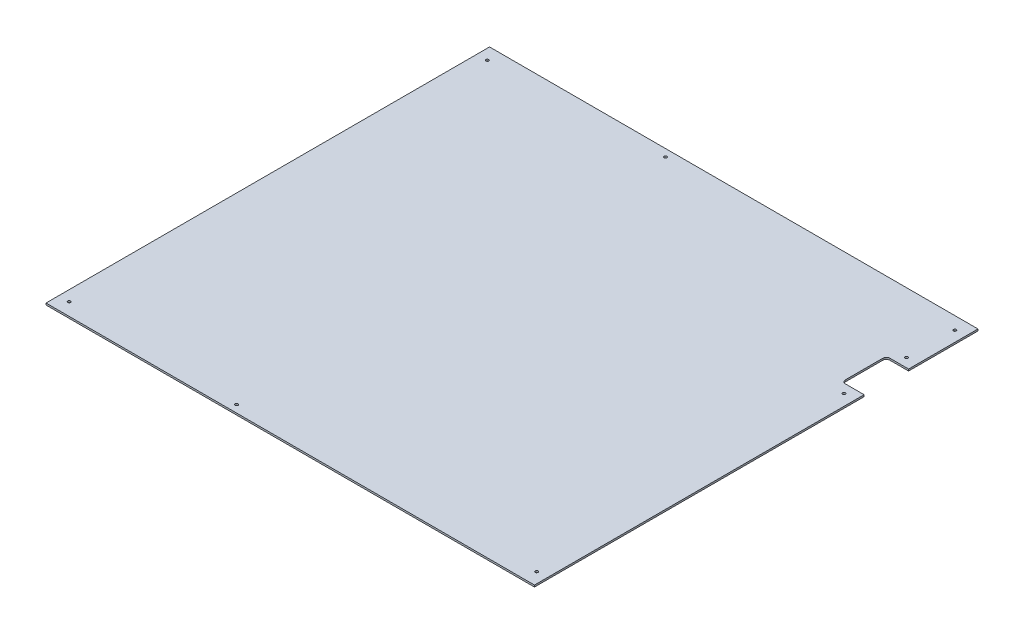
ISO-10303-21;
HEADER;
FILE_DESCRIPTION(('STEP AP214'),'2;1');
FILE_NAME('part.step','',(''),(''),'','','');
FILE_SCHEMA(('AUTOMOTIVE_DESIGN { 1 0 10303 214 1 1 1 1 }'));
ENDSEC;
DATA;
#1=APPLICATION_CONTEXT('core data for automotive mechanical design processes');
#2=APPLICATION_PROTOCOL_DEFINITION('international standard','automotive_design',2000,#1);
#3=PRODUCT_CONTEXT('',#1,'mechanical');
#4=PRODUCT('Part','Part','',(#3));
#5=PRODUCT_RELATED_PRODUCT_CATEGORY('part','',(#4));
#6=PRODUCT_DEFINITION_FORMATION('','',#4);
#7=PRODUCT_DEFINITION_CONTEXT('part definition',#1,'design');
#8=PRODUCT_DEFINITION('design','',#6,#7);
#9=PRODUCT_DEFINITION_SHAPE('','',#8);
#10=(LENGTH_UNIT() NAMED_UNIT(*) SI_UNIT(.MILLI.,.METRE.));
#11=(NAMED_UNIT(*) PLANE_ANGLE_UNIT() SI_UNIT($,.RADIAN.));
#12=(NAMED_UNIT(*) SI_UNIT($,.STERADIAN.) SOLID_ANGLE_UNIT());
#13=UNCERTAINTY_MEASURE_WITH_UNIT(LENGTH_MEASURE(1.E-05),#10,'distance_accuracy_value','');
#14=(GEOMETRIC_REPRESENTATION_CONTEXT(3) GLOBAL_UNCERTAINTY_ASSIGNED_CONTEXT((#13)) GLOBAL_UNIT_ASSIGNED_CONTEXT((#10,
#11,#12)) REPRESENTATION_CONTEXT('',''));
#15=CARTESIAN_POINT('',(0.,0.,0.));
#16=DIRECTION('',(0.,0.,1.));
#17=DIRECTION('',(1.,0.,0.));
#18=AXIS2_PLACEMENT_3D('',#15,#16,#17);
#19=CARTESIAN_POINT('',(549.75,-743.673483458971,-0.750000000000034));
#20=DIRECTION('',(1.,0.,0.));
#21=DIRECTION('',(0.,0.,-1.));
#22=AXIS2_PLACEMENT_3D('',#19,#20,#21);
#23=PLANE('',#22);
#24=DIRECTION('',(0.,1.,0.));
#25=VECTOR('',#24,1.);
#26=CARTESIAN_POINT('',(549.75,-55.9016994374947,-421.25));
#27=LINE('',#26,#25);
#28=CARTESIAN_POINT('',(549.75,0.,-421.25));
#29=VERTEX_POINT('',#28);
#30=CARTESIAN_POINT('',(549.75,2.,-421.25));
#31=VERTEX_POINT('',#30);
#32=EDGE_CURVE('E113',#29,#31,#27,.T.);
#33=ORIENTED_EDGE('',*,*,#32,.F.);
#34=DIRECTION('',(0.,0.,-1.));
#35=VECTOR('',#34,1.);
#36=CARTESIAN_POINT('',(549.75,0.,-0.750000000000034));
#37=LINE('',#36,#35);
#38=CARTESIAN_POINT('',(549.75,0.,-499.25));
#39=VERTEX_POINT('',#38);
#40=EDGE_CURVE('E146',#29,#39,#37,.T.);
#41=ORIENTED_EDGE('',*,*,#40,.T.);
#42=DIRECTION('',(0.,1.,0.));
#43=VECTOR('',#42,1.);
#44=CARTESIAN_POINT('',(549.75,-743.673483458971,-499.25));
#45=LINE('',#44,#43);
#46=CARTESIAN_POINT('',(549.75,2.,-499.25));
#47=VERTEX_POINT('',#46);
#48=EDGE_CURVE('E131',#39,#47,#45,.T.);
#49=ORIENTED_EDGE('',*,*,#48,.T.);
#50=DIRECTION('',(0.,0.,-1.));
#51=VECTOR('',#50,1.);
#52=CARTESIAN_POINT('',(549.75,2.,-0.750000000000034));
#53=LINE('',#52,#51);
#54=EDGE_CURVE('E125',#31,#47,#53,.T.);
#55=ORIENTED_EDGE('',*,*,#54,.F.);
#56=EDGE_LOOP('',(#33,#41,#49,#55));
#57=FACE_BOUND('',#56,.T.);
#58=ADVANCED_FACE('F39',(#57),#23,.T.);
#59=CARTESIAN_POINT('',(0.,2.,0.));
#60=DIRECTION('',(0.,-1.,0.));
#61=DIRECTION('',(0.,0.,-1.));
#62=AXIS2_PLACEMENT_3D('',#59,#60,#61);
#63=PLANE('',#62);
#64=CARTESIAN_POINT('',(206.75,2.,-491.));
#65=DIRECTION('',(0.,1.,0.));
#66=DIRECTION('',(0.,0.,1.));
#67=AXIS2_PLACEMENT_3D('',#64,#65,#66);
#68=CIRCLE('',#67,1.59999999999999);
#69=CARTESIAN_POINT('',(206.75,2.,-489.4));
#70=VERTEX_POINT('',#69);
#71=EDGE_CURVE('E375',#70,#70,#68,.T.);
#72=ORIENTED_EDGE('',*,*,#71,.F.);
#73=EDGE_LOOP('',(#72));
#74=FACE_BOUND('',#73,.T.);
#75=CARTESIAN_POINT('',(206.75,2.,-9.00000000000001));
#76=DIRECTION('',(0.,1.,0.));
#77=DIRECTION('',(0.,0.,1.));
#78=AXIS2_PLACEMENT_3D('',#75,#76,#77);
#79=CIRCLE('',#78,1.59999999999999);
#80=CARTESIAN_POINT('',(206.75,2.,-7.40000000000002));
#81=VERTEX_POINT('',#80);
#82=EDGE_CURVE('E390',#81,#81,#79,.T.);
#83=ORIENTED_EDGE('',*,*,#82,.F.);
#84=EDGE_LOOP('',(#83));
#85=FACE_BOUND('',#84,.T.);
#86=CARTESIAN_POINT('',(537.25,2.,-431.25));
#87=DIRECTION('',(0.,1.,0.));
#88=DIRECTION('',(0.,0.,1.));
#89=AXIS2_PLACEMENT_3D('',#86,#87,#88);
#90=CIRCLE('',#89,1.60000000000002);
#91=CARTESIAN_POINT('',(537.25,2.,-429.65));
#92=VERTEX_POINT('',#91);
#93=EDGE_CURVE('E397',#92,#92,#90,.T.);
#94=ORIENTED_EDGE('',*,*,#93,.F.);
#95=EDGE_LOOP('',(#94));
#96=FACE_BOUND('',#95,.T.);
#97=CARTESIAN_POINT('',(537.25,2.,-361.25));
#98=DIRECTION('',(0.,1.,0.));
#99=DIRECTION('',(0.,0.,1.));
#100=AXIS2_PLACEMENT_3D('',#97,#98,#99);
#101=CIRCLE('',#100,1.60000000000002);
#102=CARTESIAN_POINT('',(537.25,2.,-359.65));
#103=VERTEX_POINT('',#102);
#104=EDGE_CURVE('E380',#103,#103,#101,.T.);
#105=ORIENTED_EDGE('',*,*,#104,.F.);
#106=EDGE_LOOP('',(#105));
#107=FACE_BOUND('',#106,.T.);
#108=CARTESIAN_POINT('',(12.5,2.,-485.));
#109=DIRECTION('',(0.,1.,0.));
#110=DIRECTION('',(0.,0.,1.));
#111=AXIS2_PLACEMENT_3D('',#108,#109,#110);
#112=CIRCLE('',#111,1.55000000000003);
#113=CARTESIAN_POINT('',(12.5,2.,-483.45));
#114=VERTEX_POINT('',#113);
#115=EDGE_CURVE('E171',#114,#114,#112,.T.);
#116=ORIENTED_EDGE('',*,*,#115,.F.);
#117=EDGE_LOOP('',(#116));
#118=FACE_BOUND('',#117,.T.);
#119=CARTESIAN_POINT('',(538.,2.,-485.));
#120=DIRECTION('',(0.,1.,0.));
#121=DIRECTION('',(0.,0.,-1.));
#122=AXIS2_PLACEMENT_3D('',#119,#120,#121);
#123=CIRCLE('',#122,1.55);
#124=CARTESIAN_POINT('',(538.,2.,-486.55));
#125=VERTEX_POINT('',#124);
#126=EDGE_CURVE('E164',#125,#125,#123,.T.);
#127=ORIENTED_EDGE('',*,*,#126,.F.);
#128=EDGE_LOOP('',(#127));
#129=FACE_BOUND('',#128,.T.);
#130=CARTESIAN_POINT('',(538.,2.,-15.0000000000001));
#131=DIRECTION('',(0.,1.,0.));
#132=DIRECTION('',(0.,0.,1.));
#133=AXIS2_PLACEMENT_3D('',#130,#131,#132);
#134=CIRCLE('',#133,1.54999999999999);
#135=CARTESIAN_POINT('',(538.,2.,-13.4500000000001));
#136=VERTEX_POINT('',#135);
#137=EDGE_CURVE('E172',#136,#136,#134,.T.);
#138=ORIENTED_EDGE('',*,*,#137,.F.);
#139=EDGE_LOOP('',(#138));
#140=FACE_BOUND('',#139,.T.);
#141=CARTESIAN_POINT('',(12.5,2.,-15.));
#142=DIRECTION('',(0.,1.,0.));
#143=DIRECTION('',(0.,0.,-1.));
#144=AXIS2_PLACEMENT_3D('',#141,#142,#143);
#145=CIRCLE('',#144,1.55000000000002);
#146=CARTESIAN_POINT('',(12.5,2.,-16.55));
#147=VERTEX_POINT('',#146);
#148=EDGE_CURVE('E153',#147,#147,#145,.T.);
#149=ORIENTED_EDGE('',*,*,#148,.F.);
#150=EDGE_LOOP('',(#149));
#151=FACE_BOUND('',#150,.T.);
#152=DIRECTION('',(0.,0.,1.));
#153=VECTOR('',#152,1.);
#154=CARTESIAN_POINT('',(524.75,2.,-421.25));
#155=LINE('',#154,#153);
#156=CARTESIAN_POINT('',(524.75,2.,-417.25));
#157=VERTEX_POINT('',#156);
#158=CARTESIAN_POINT('',(524.75,2.,-375.25));
#159=VERTEX_POINT('',#158);
#160=EDGE_CURVE('E127',#157,#159,#155,.T.);
#161=ORIENTED_EDGE('',*,*,#160,.F.);
#162=CARTESIAN_POINT('',(528.75,2.,-417.25));
#163=DIRECTION('',(0.,-1.,0.));
#164=DIRECTION('',(0.,0.,-1.));
#165=AXIS2_PLACEMENT_3D('',#162,#163,#164);
#166=CIRCLE('',#165,4.);
#167=CARTESIAN_POINT('',(528.75,2.,-421.25));
#168=VERTEX_POINT('',#167);
#169=EDGE_CURVE('E47',#157,#168,#166,.T.);
#170=ORIENTED_EDGE('',*,*,#169,.T.);
#171=DIRECTION('',(-1.,0.,0.));
#172=VECTOR('',#171,1.);
#173=CARTESIAN_POINT('',(549.75,2.,-421.25));
#174=LINE('',#173,#172);
#175=EDGE_CURVE('E115',#31,#168,#174,.T.);
#176=ORIENTED_EDGE('',*,*,#175,.F.);
#177=ORIENTED_EDGE('',*,*,#54,.T.);
#178=DIRECTION('',(-1.,0.,0.));
#179=VECTOR('',#178,1.);
#180=CARTESIAN_POINT('',(549.75,2.,-499.25));
#181=LINE('',#180,#179);
#182=CARTESIAN_POINT('',(0.75,2.,-499.25));
#183=VERTEX_POINT('',#182);
#184=EDGE_CURVE('E140',#47,#183,#181,.T.);
#185=ORIENTED_EDGE('',*,*,#184,.T.);
#186=DIRECTION('',(0.,0.,1.));
#187=VECTOR('',#186,1.);
#188=CARTESIAN_POINT('',(0.75,2.,-499.25));
#189=LINE('',#188,#187);
#190=CARTESIAN_POINT('',(0.750000000000061,2.,-0.75));
#191=VERTEX_POINT('',#190);
#192=EDGE_CURVE('E162',#183,#191,#189,.T.);
#193=ORIENTED_EDGE('',*,*,#192,.T.);
#194=DIRECTION('',(1.,0.,0.));
#195=VECTOR('',#194,1.);
#196=CARTESIAN_POINT('',(0.750000000000061,2.,-0.75));
#197=LINE('',#196,#195);
#198=CARTESIAN_POINT('',(549.75,2.,-0.750000000000034));
#199=VERTEX_POINT('',#198);
#200=EDGE_CURVE('E158',#191,#199,#197,.T.);
#201=ORIENTED_EDGE('',*,*,#200,.T.);
#202=CARTESIAN_POINT('',(549.75,2.,-371.25));
#203=VERTEX_POINT('',#202);
#204=EDGE_CURVE('E133',#199,#203,#53,.T.);
#205=ORIENTED_EDGE('',*,*,#204,.T.);
#206=DIRECTION('',(1.,0.,0.));
#207=VECTOR('',#206,1.);
#208=CARTESIAN_POINT('',(549.75,2.,-371.25));
#209=LINE('',#208,#207);
#210=CARTESIAN_POINT('',(528.75,2.,-371.25));
#211=VERTEX_POINT('',#210);
#212=EDGE_CURVE('E220',#211,#203,#209,.T.);
#213=ORIENTED_EDGE('',*,*,#212,.F.);
#214=CARTESIAN_POINT('',(528.75,2.,-375.25));
#215=DIRECTION('',(0.,-1.,0.));
#216=DIRECTION('',(0.,0.,-1.));
#217=AXIS2_PLACEMENT_3D('',#214,#215,#216);
#218=CIRCLE('',#217,4.);
#219=EDGE_CURVE('E196',#211,#159,#218,.T.);
#220=ORIENTED_EDGE('',*,*,#219,.T.);
#221=EDGE_LOOP('',(#161,#170,#176,#177,#185,#193,#201,#205,#213,#220));
#222=FACE_BOUND('',#221,.T.);
#223=ADVANCED_FACE('F123',(#74,#85,#96,#107,#118,#129,#140,#151,#222),#63,.F.);
#224=CARTESIAN_POINT('',(0.,0.,0.));
#225=DIRECTION('',(0.,-1.,0.));
#226=DIRECTION('',(0.,0.,-1.));
#227=AXIS2_PLACEMENT_3D('',#224,#225,#226);
#228=PLANE('',#227);
#229=CARTESIAN_POINT('',(206.75,0.,-491.));
#230=DIRECTION('',(0.,-1.,0.));
#231=DIRECTION('',(0.,0.,-1.));
#232=AXIS2_PLACEMENT_3D('',#229,#230,#231);
#233=CIRCLE('',#232,1.59999999999999);
#234=CARTESIAN_POINT('',(206.75,0.,-492.6));
#235=VERTEX_POINT('',#234);
#236=EDGE_CURVE('E378',#235,#235,#233,.F.);
#237=ORIENTED_EDGE('',*,*,#236,.T.);
#238=EDGE_LOOP('',(#237));
#239=FACE_BOUND('',#238,.T.);
#240=CARTESIAN_POINT('',(206.75,0.,-9.00000000000001));
#241=DIRECTION('',(0.,-1.,0.));
#242=DIRECTION('',(0.,0.,-1.));
#243=AXIS2_PLACEMENT_3D('',#240,#241,#242);
#244=CIRCLE('',#243,1.59999999999999);
#245=CARTESIAN_POINT('',(206.75,0.,-10.6));
#246=VERTEX_POINT('',#245);
#247=EDGE_CURVE('E387',#246,#246,#244,.F.);
#248=ORIENTED_EDGE('',*,*,#247,.T.);
#249=EDGE_LOOP('',(#248));
#250=FACE_BOUND('',#249,.T.);
#251=CARTESIAN_POINT('',(537.25,0.,-431.25));
#252=DIRECTION('',(0.,-1.,0.));
#253=DIRECTION('',(0.,0.,-1.));
#254=AXIS2_PLACEMENT_3D('',#251,#252,#253);
#255=CIRCLE('',#254,1.60000000000002);
#256=CARTESIAN_POINT('',(537.25,0.,-432.85));
#257=VERTEX_POINT('',#256);
#258=EDGE_CURVE('E128',#257,#257,#255,.F.);
#259=ORIENTED_EDGE('',*,*,#258,.T.);
#260=EDGE_LOOP('',(#259));
#261=FACE_BOUND('',#260,.T.);
#262=CARTESIAN_POINT('',(537.25,0.,-361.25));
#263=DIRECTION('',(0.,-1.,0.));
#264=DIRECTION('',(0.,0.,-1.));
#265=AXIS2_PLACEMENT_3D('',#262,#263,#264);
#266=CIRCLE('',#265,1.60000000000002);
#267=CARTESIAN_POINT('',(537.25,0.,-362.85));
#268=VERTEX_POINT('',#267);
#269=EDGE_CURVE('E384',#268,#268,#266,.F.);
#270=ORIENTED_EDGE('',*,*,#269,.T.);
#271=EDGE_LOOP('',(#270));
#272=FACE_BOUND('',#271,.T.);
#273=DIRECTION('',(-1.,0.,0.));
#274=VECTOR('',#273,1.);
#275=CARTESIAN_POINT('',(549.75,0.,-421.25));
#276=LINE('',#275,#274);
#277=CARTESIAN_POINT('',(528.75,0.,-421.25));
#278=VERTEX_POINT('',#277);
#279=EDGE_CURVE('E116',#29,#278,#276,.T.);
#280=ORIENTED_EDGE('',*,*,#279,.T.);
#281=CARTESIAN_POINT('',(528.75,0.,-417.25));
#282=DIRECTION('',(0.,-1.,0.));
#283=DIRECTION('',(0.,0.,-1.));
#284=AXIS2_PLACEMENT_3D('',#281,#282,#283);
#285=CIRCLE('',#284,4.);
#286=CARTESIAN_POINT('',(524.75,0.,-417.25));
#287=VERTEX_POINT('',#286);
#288=EDGE_CURVE('E11',#278,#287,#285,.F.);
#289=ORIENTED_EDGE('',*,*,#288,.T.);
#290=DIRECTION('',(0.,0.,1.));
#291=VECTOR('',#290,1.);
#292=CARTESIAN_POINT('',(524.75,0.,-421.25));
#293=LINE('',#292,#291);
#294=CARTESIAN_POINT('',(524.75,0.,-375.25));
#295=VERTEX_POINT('',#294);
#296=EDGE_CURVE('E209',#287,#295,#293,.T.);
#297=ORIENTED_EDGE('',*,*,#296,.T.);
#298=CARTESIAN_POINT('',(528.75,0.,-375.25));
#299=DIRECTION('',(0.,-1.,0.));
#300=DIRECTION('',(0.,0.,-1.));
#301=AXIS2_PLACEMENT_3D('',#298,#299,#300);
#302=CIRCLE('',#301,4.);
#303=CARTESIAN_POINT('',(528.75,0.,-371.25));
#304=VERTEX_POINT('',#303);
#305=EDGE_CURVE('E198',#295,#304,#302,.F.);
#306=ORIENTED_EDGE('',*,*,#305,.T.);
#307=DIRECTION('',(1.,0.,0.));
#308=VECTOR('',#307,1.);
#309=CARTESIAN_POINT('',(549.75,0.,-371.25));
#310=LINE('',#309,#308);
#311=CARTESIAN_POINT('',(549.75,0.,-371.25));
#312=VERTEX_POINT('',#311);
#313=EDGE_CURVE('E206',#304,#312,#310,.T.);
#314=ORIENTED_EDGE('',*,*,#313,.T.);
#315=CARTESIAN_POINT('',(549.75,0.,-0.750000000000034));
#316=VERTEX_POINT('',#315);
#317=EDGE_CURVE('E142',#316,#312,#37,.T.);
#318=ORIENTED_EDGE('',*,*,#317,.F.);
#319=DIRECTION('',(1.,0.,0.));
#320=VECTOR('',#319,1.);
#321=CARTESIAN_POINT('',(0.750000000000061,0.,-0.75));
#322=LINE('',#321,#320);
#323=CARTESIAN_POINT('',(0.750000000000061,0.,-0.75));
#324=VERTEX_POINT('',#323);
#325=EDGE_CURVE('E147',#324,#316,#322,.T.);
#326=ORIENTED_EDGE('',*,*,#325,.F.);
#327=DIRECTION('',(0.,0.,1.));
#328=VECTOR('',#327,1.);
#329=CARTESIAN_POINT('',(0.75,0.,-499.25));
#330=LINE('',#329,#328);
#331=CARTESIAN_POINT('',(0.750000000000028,0.,-499.25));
#332=VERTEX_POINT('',#331);
#333=EDGE_CURVE('E150',#332,#324,#330,.T.);
#334=ORIENTED_EDGE('',*,*,#333,.F.);
#335=DIRECTION('',(-1.,0.,0.));
#336=VECTOR('',#335,1.);
#337=CARTESIAN_POINT('',(549.75,0.,-499.25));
#338=LINE('',#337,#336);
#339=EDGE_CURVE('E145',#39,#332,#338,.T.);
#340=ORIENTED_EDGE('',*,*,#339,.F.);
#341=ORIENTED_EDGE('',*,*,#40,.F.);
#342=EDGE_LOOP('',(#280,#289,#297,#306,#314,#318,#326,#334,#340,#341));
#343=FACE_BOUND('',#342,.T.);
#344=CARTESIAN_POINT('',(12.5,0.,-485.));
#345=DIRECTION('',(0.,-1.,0.));
#346=DIRECTION('',(0.,0.,-1.));
#347=AXIS2_PLACEMENT_3D('',#344,#345,#346);
#348=CIRCLE('',#347,1.55000000000003);
#349=CARTESIAN_POINT('',(12.5,0.,-486.55));
#350=VERTEX_POINT('',#349);
#351=EDGE_CURVE('E184',#350,#350,#348,.F.);
#352=ORIENTED_EDGE('',*,*,#351,.T.);
#353=EDGE_LOOP('',(#352));
#354=FACE_BOUND('',#353,.T.);
#355=CARTESIAN_POINT('',(538.,0.,-485.));
#356=DIRECTION('',(0.,-1.,0.));
#357=DIRECTION('',(0.,0.,-1.));
#358=AXIS2_PLACEMENT_3D('',#355,#356,#357);
#359=CIRCLE('',#358,1.55);
#360=CARTESIAN_POINT('',(538.,0.,-486.55));
#361=VERTEX_POINT('',#360);
#362=EDGE_CURVE('E167',#361,#361,#359,.F.);
#363=ORIENTED_EDGE('',*,*,#362,.T.);
#364=EDGE_LOOP('',(#363));
#365=FACE_BOUND('',#364,.T.);
#366=CARTESIAN_POINT('',(538.,0.,-15.0000000000001));
#367=DIRECTION('',(0.,-1.,0.));
#368=DIRECTION('',(0.,0.,-1.));
#369=AXIS2_PLACEMENT_3D('',#366,#367,#368);
#370=CIRCLE('',#369,1.54999999999999);
#371=CARTESIAN_POINT('',(538.,0.,-16.5500000000001));
#372=VERTEX_POINT('',#371);
#373=EDGE_CURVE('E168',#372,#372,#370,.F.);
#374=ORIENTED_EDGE('',*,*,#373,.T.);
#375=EDGE_LOOP('',(#374));
#376=FACE_BOUND('',#375,.T.);
#377=CARTESIAN_POINT('',(12.5,0.,-15.));
#378=DIRECTION('',(0.,-1.,0.));
#379=DIRECTION('',(0.,0.,-1.));
#380=AXIS2_PLACEMENT_3D('',#377,#378,#379);
#381=CIRCLE('',#380,1.55000000000002);
#382=CARTESIAN_POINT('',(12.5,0.,-16.55));
#383=VERTEX_POINT('',#382);
#384=EDGE_CURVE('E175',#383,#383,#381,.F.);
#385=ORIENTED_EDGE('',*,*,#384,.T.);
#386=EDGE_LOOP('',(#385));
#387=FACE_BOUND('',#386,.T.);
#388=ADVANCED_FACE('F203',(#239,#250,#261,#272,#343,#354,#365,#376,#387),#228,.T.);
#389=CARTESIAN_POINT('',(12.5,-4.38406204335671,-485.));
#390=DIRECTION('',(0.,1.,0.));
#391=DIRECTION('',(0.,0.,1.));
#392=AXIS2_PLACEMENT_3D('',#389,#390,#391);
#393=CYLINDRICAL_SURFACE('',#392,1.55000000000003);
#394=ORIENTED_EDGE('',*,*,#115,.T.);
#395=EDGE_LOOP('',(#394));
#396=FACE_BOUND('',#395,.T.);
#397=ORIENTED_EDGE('',*,*,#351,.F.);
#398=EDGE_LOOP('',(#397));
#399=FACE_BOUND('',#398,.T.);
#400=ADVANCED_FACE('F267',(#396,#399),#393,.F.);
#401=CARTESIAN_POINT('',(538.,-4.38406204335671,-485.));
#402=DIRECTION('',(0.,1.,0.));
#403=DIRECTION('',(0.,0.,1.));
#404=AXIS2_PLACEMENT_3D('',#401,#402,#403);
#405=CYLINDRICAL_SURFACE('',#404,1.55);
#406=ORIENTED_EDGE('',*,*,#126,.T.);
#407=EDGE_LOOP('',(#406));
#408=FACE_BOUND('',#407,.T.);
#409=ORIENTED_EDGE('',*,*,#362,.F.);
#410=EDGE_LOOP('',(#409));
#411=FACE_BOUND('',#410,.T.);
#412=ADVANCED_FACE('F426',(#408,#411),#405,.F.);
#413=CARTESIAN_POINT('',(538.,-4.38406204335671,-15.0000000000001));
#414=DIRECTION('',(0.,1.,0.));
#415=DIRECTION('',(0.,0.,1.));
#416=AXIS2_PLACEMENT_3D('',#413,#414,#415);
#417=CYLINDRICAL_SURFACE('',#416,1.54999999999999);
#418=ORIENTED_EDGE('',*,*,#137,.T.);
#419=EDGE_LOOP('',(#418));
#420=FACE_BOUND('',#419,.T.);
#421=ORIENTED_EDGE('',*,*,#373,.F.);
#422=EDGE_LOOP('',(#421));
#423=FACE_BOUND('',#422,.T.);
#424=ADVANCED_FACE('F254',(#420,#423),#417,.F.);
#425=CARTESIAN_POINT('',(12.5,-4.38406204335671,-15.));
#426=DIRECTION('',(0.,1.,0.));
#427=DIRECTION('',(0.,0.,1.));
#428=AXIS2_PLACEMENT_3D('',#425,#426,#427);
#429=CYLINDRICAL_SURFACE('',#428,1.55000000000002);
#430=ORIENTED_EDGE('',*,*,#148,.T.);
#431=EDGE_LOOP('',(#430));
#432=FACE_BOUND('',#431,.T.);
#433=ORIENTED_EDGE('',*,*,#384,.F.);
#434=EDGE_LOOP('',(#433));
#435=FACE_BOUND('',#434,.T.);
#436=ADVANCED_FACE('F247',(#432,#435),#429,.F.);
#437=DIRECTION('',(0.,1.,0.));
#438=VECTOR('',#437,1.);
#439=CARTESIAN_POINT('',(549.75,-55.9016994374947,-371.25));
#440=LINE('',#439,#438);
#441=EDGE_CURVE('E121',#312,#203,#440,.T.);
#442=ORIENTED_EDGE('',*,*,#441,.T.);
#443=ORIENTED_EDGE('',*,*,#204,.F.);
#444=DIRECTION('',(0.,1.,0.));
#445=VECTOR('',#444,1.);
#446=CARTESIAN_POINT('',(549.75,-743.673483458971,-0.750000000000034));
#447=LINE('',#446,#445);
#448=EDGE_CURVE('E120',#316,#199,#447,.T.);
#449=ORIENTED_EDGE('',*,*,#448,.F.);
#450=ORIENTED_EDGE('',*,*,#317,.T.);
#451=EDGE_LOOP('',(#442,#443,#449,#450));
#452=FACE_BOUND('',#451,.T.);
#453=ADVANCED_FACE('F245',(#452),#23,.T.);
#454=CARTESIAN_POINT('',(0.750000000000061,-743.673483458971,-0.75));
#455=DIRECTION('',(0.,0.,1.));
#456=DIRECTION('',(1.,0.,0.));
#457=AXIS2_PLACEMENT_3D('',#454,#455,#456);
#458=PLANE('',#457);
#459=ORIENTED_EDGE('',*,*,#325,.T.);
#460=ORIENTED_EDGE('',*,*,#448,.T.);
#461=ORIENTED_EDGE('',*,*,#200,.F.);
#462=DIRECTION('',(0.,1.,0.));
#463=VECTOR('',#462,1.);
#464=CARTESIAN_POINT('',(0.750000000000061,-743.673483458971,-0.75));
#465=LINE('',#464,#463);
#466=EDGE_CURVE('E136',#324,#191,#465,.T.);
#467=ORIENTED_EDGE('',*,*,#466,.F.);
#468=EDGE_LOOP('',(#459,#460,#461,#467));
#469=FACE_BOUND('',#468,.T.);
#470=ADVANCED_FACE('F242',(#469),#458,.T.);
#471=CARTESIAN_POINT('',(0.75,-743.673483458971,-499.25));
#472=DIRECTION('',(-1.,0.,0.));
#473=DIRECTION('',(0.,0.,1.));
#474=AXIS2_PLACEMENT_3D('',#471,#472,#473);
#475=PLANE('',#474);
#476=ORIENTED_EDGE('',*,*,#333,.T.);
#477=ORIENTED_EDGE('',*,*,#466,.T.);
#478=ORIENTED_EDGE('',*,*,#192,.F.);
#479=DIRECTION('',(0.,1.,0.));
#480=VECTOR('',#479,1.);
#481=CARTESIAN_POINT('',(0.75,-743.673483458971,-499.25));
#482=LINE('',#481,#480);
#483=EDGE_CURVE('E159',#332,#183,#482,.T.);
#484=ORIENTED_EDGE('',*,*,#483,.F.);
#485=EDGE_LOOP('',(#476,#477,#478,#484));
#486=FACE_BOUND('',#485,.T.);
#487=ADVANCED_FACE('F235',(#486),#475,.T.);
#488=CARTESIAN_POINT('',(549.75,-743.673483458971,-499.25));
#489=DIRECTION('',(0.,0.,-1.));
#490=DIRECTION('',(-1.,0.,0.));
#491=AXIS2_PLACEMENT_3D('',#488,#489,#490);
#492=PLANE('',#491);
#493=ORIENTED_EDGE('',*,*,#339,.T.);
#494=ORIENTED_EDGE('',*,*,#483,.T.);
#495=ORIENTED_EDGE('',*,*,#184,.F.);
#496=ORIENTED_EDGE('',*,*,#48,.F.);
#497=EDGE_LOOP('',(#493,#494,#495,#496));
#498=FACE_BOUND('',#497,.T.);
#499=ADVANCED_FACE('F237',(#498),#492,.T.);
#500=CARTESIAN_POINT('',(549.75,-55.9016994374947,-421.25));
#501=DIRECTION('',(0.,0.,-1.));
#502=DIRECTION('',(-1.,0.,0.));
#503=AXIS2_PLACEMENT_3D('',#500,#501,#502);
#504=PLANE('',#503);
#505=ORIENTED_EDGE('',*,*,#175,.T.);
#506=DIRECTION('',(0.,1.,0.));
#507=VECTOR('',#506,1.);
#508=CARTESIAN_POINT('',(528.75,0.,-421.25));
#509=LINE('',#508,#507);
#510=EDGE_CURVE('E54',#168,#278,#509,.F.);
#511=ORIENTED_EDGE('',*,*,#510,.T.);
#512=ORIENTED_EDGE('',*,*,#279,.F.);
#513=ORIENTED_EDGE('',*,*,#32,.T.);
#514=EDGE_LOOP('',(#505,#511,#512,#513));
#515=FACE_BOUND('',#514,.T.);
#516=ADVANCED_FACE('F114',(#515),#504,.F.);
#517=CARTESIAN_POINT('',(524.75,-55.9016994374947,-421.25));
#518=DIRECTION('',(-1.,0.,0.));
#519=DIRECTION('',(0.,0.,1.));
#520=AXIS2_PLACEMENT_3D('',#517,#518,#519);
#521=PLANE('',#520);
#522=ORIENTED_EDGE('',*,*,#160,.T.);
#523=DIRECTION('',(0.,1.,0.));
#524=VECTOR('',#523,1.);
#525=CARTESIAN_POINT('',(524.75,0.,-375.25));
#526=LINE('',#525,#524);
#527=EDGE_CURVE('E193',#159,#295,#526,.F.);
#528=ORIENTED_EDGE('',*,*,#527,.T.);
#529=ORIENTED_EDGE('',*,*,#296,.F.);
#530=DIRECTION('',(0.,1.,0.));
#531=VECTOR('',#530,1.);
#532=CARTESIAN_POINT('',(524.75,2.,-417.25));
#533=LINE('',#532,#531);
#534=EDGE_CURVE('E190',#287,#157,#533,.T.);
#535=ORIENTED_EDGE('',*,*,#534,.T.);
#536=EDGE_LOOP('',(#522,#528,#529,#535));
#537=FACE_BOUND('',#536,.T.);
#538=ADVANCED_FACE('F222',(#537),#521,.F.);
#539=CARTESIAN_POINT('',(549.75,-55.9016994374947,-371.25));
#540=DIRECTION('',(0.,0.,1.));
#541=DIRECTION('',(1.,0.,0.));
#542=AXIS2_PLACEMENT_3D('',#539,#540,#541);
#543=PLANE('',#542);
#544=ORIENTED_EDGE('',*,*,#313,.F.);
#545=DIRECTION('',(0.,1.,0.));
#546=VECTOR('',#545,1.);
#547=CARTESIAN_POINT('',(528.75,2.,-371.25));
#548=LINE('',#547,#546);
#549=EDGE_CURVE('E187',#304,#211,#548,.T.);
#550=ORIENTED_EDGE('',*,*,#549,.T.);
#551=ORIENTED_EDGE('',*,*,#212,.T.);
#552=ORIENTED_EDGE('',*,*,#441,.F.);
#553=EDGE_LOOP('',(#544,#550,#551,#552));
#554=FACE_BOUND('',#553,.T.);
#555=ADVANCED_FACE('F214',(#554),#543,.F.);
#556=CARTESIAN_POINT('',(528.75,-55.9016994374947,-375.25));
#557=DIRECTION('',(0.,-1.,0.));
#558=DIRECTION('',(0.,0.,-1.));
#559=AXIS2_PLACEMENT_3D('',#556,#557,#558);
#560=CYLINDRICAL_SURFACE('',#559,4.);
#561=ORIENTED_EDGE('',*,*,#305,.F.);
#562=ORIENTED_EDGE('',*,*,#527,.F.);
#563=ORIENTED_EDGE('',*,*,#219,.F.);
#564=ORIENTED_EDGE('',*,*,#549,.F.);
#565=EDGE_LOOP('',(#561,#562,#563,#564));
#566=FACE_BOUND('',#565,.T.);
#567=ADVANCED_FACE('F218',(#566),#560,.F.);
#568=CARTESIAN_POINT('',(528.75,-55.9016994374947,-417.25));
#569=DIRECTION('',(0.,-1.,0.));
#570=DIRECTION('',(0.,0.,-1.));
#571=AXIS2_PLACEMENT_3D('',#568,#569,#570);
#572=CYLINDRICAL_SURFACE('',#571,4.);
#573=ORIENTED_EDGE('',*,*,#288,.F.);
#574=ORIENTED_EDGE('',*,*,#510,.F.);
#575=ORIENTED_EDGE('',*,*,#169,.F.);
#576=ORIENTED_EDGE('',*,*,#534,.F.);
#577=EDGE_LOOP('',(#573,#574,#575,#576));
#578=FACE_BOUND('',#577,.T.);
#579=ADVANCED_FACE('F41',(#578),#572,.F.);
#580=CARTESIAN_POINT('',(537.25,-4.52548339959396,-361.25));
#581=DIRECTION('',(0.,1.,0.));
#582=DIRECTION('',(0.,0.,1.));
#583=AXIS2_PLACEMENT_3D('',#580,#581,#582);
#584=CYLINDRICAL_SURFACE('',#583,1.60000000000002);
#585=ORIENTED_EDGE('',*,*,#104,.T.);
#586=EDGE_LOOP('',(#585));
#587=FACE_BOUND('',#586,.T.);
#588=ORIENTED_EDGE('',*,*,#269,.F.);
#589=EDGE_LOOP('',(#588));
#590=FACE_BOUND('',#589,.T.);
#591=ADVANCED_FACE('F278',(#587,#590),#584,.F.);
#592=CARTESIAN_POINT('',(537.25,-4.52548339959396,-431.25));
#593=DIRECTION('',(0.,1.,0.));
#594=DIRECTION('',(0.,0.,1.));
#595=AXIS2_PLACEMENT_3D('',#592,#593,#594);
#596=CYLINDRICAL_SURFACE('',#595,1.60000000000002);
#597=ORIENTED_EDGE('',*,*,#93,.T.);
#598=EDGE_LOOP('',(#597));
#599=FACE_BOUND('',#598,.T.);
#600=ORIENTED_EDGE('',*,*,#258,.F.);
#601=EDGE_LOOP('',(#600));
#602=FACE_BOUND('',#601,.T.);
#603=ADVANCED_FACE('F332',(#599,#602),#596,.F.);
#604=CARTESIAN_POINT('',(206.75,-4.52548339959388,-9.00000000000001));
#605=DIRECTION('',(0.,1.,0.));
#606=DIRECTION('',(0.,0.,1.));
#607=AXIS2_PLACEMENT_3D('',#604,#605,#606);
#608=CYLINDRICAL_SURFACE('',#607,1.59999999999999);
#609=ORIENTED_EDGE('',*,*,#82,.T.);
#610=EDGE_LOOP('',(#609));
#611=FACE_BOUND('',#610,.T.);
#612=ORIENTED_EDGE('',*,*,#247,.F.);
#613=EDGE_LOOP('',(#612));
#614=FACE_BOUND('',#613,.T.);
#615=ADVANCED_FACE('F340',(#611,#614),#608,.F.);
#616=CARTESIAN_POINT('',(206.75,-4.52548339959388,-491.));
#617=DIRECTION('',(0.,1.,0.));
#618=DIRECTION('',(0.,0.,1.));
#619=AXIS2_PLACEMENT_3D('',#616,#617,#618);
#620=CYLINDRICAL_SURFACE('',#619,1.59999999999999);
#621=ORIENTED_EDGE('',*,*,#71,.T.);
#622=EDGE_LOOP('',(#621));
#623=FACE_BOUND('',#622,.T.);
#624=ORIENTED_EDGE('',*,*,#236,.F.);
#625=EDGE_LOOP('',(#624));
#626=FACE_BOUND('',#625,.T.);
#627=ADVANCED_FACE('F359',(#623,#626),#620,.F.);
#628=CLOSED_SHELL('',(#58,#223,#388,#400,#412,#424,#436,#453,#470,#487,#499,#516,#538,#555,#567,
#579,#591,#603,#615,#627));
#629=MANIFOLD_SOLID_BREP('B2',#628);
#630=ADVANCED_BREP_SHAPE_REPRESENTATION('',(#18,#629),#14);
#631=SHAPE_DEFINITION_REPRESENTATION(#9,#630);
ENDSEC;
END-ISO-10303-21;
